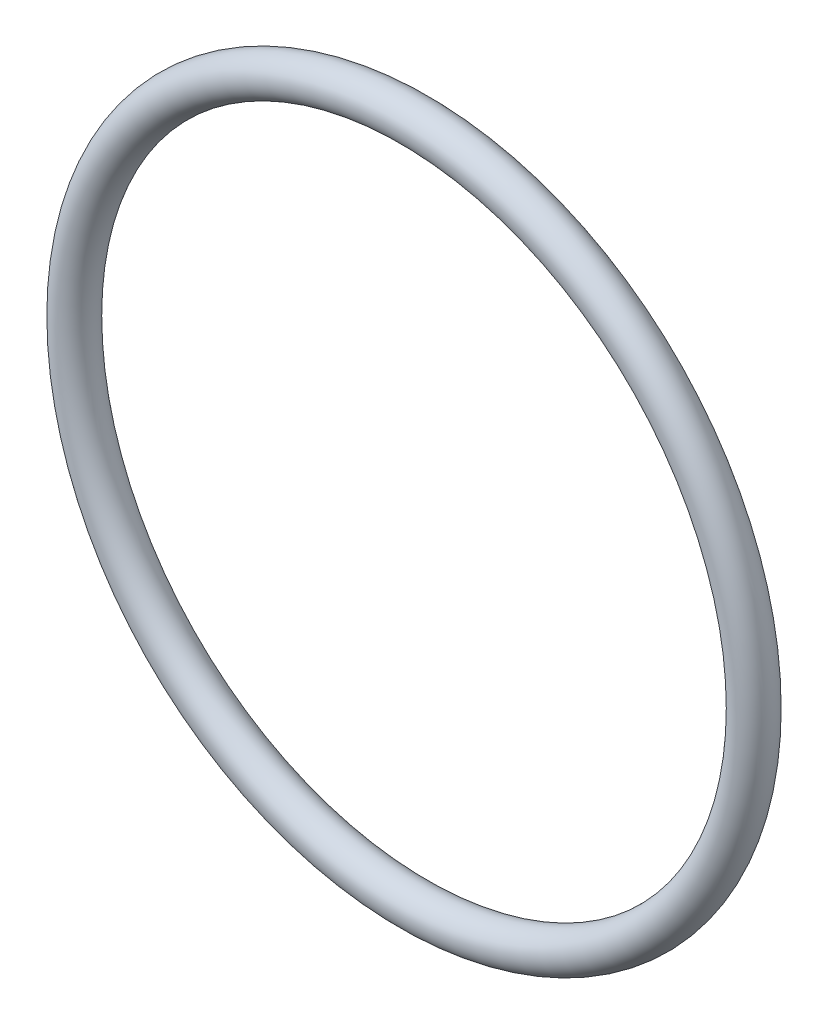
ISO-10303-21;
HEADER;
FILE_DESCRIPTION(('STEP AP214'),'2;1');
FILE_NAME('part.step','',(''),(''),'','','');
FILE_SCHEMA(('AUTOMOTIVE_DESIGN { 1 0 10303 214 1 1 1 1 }'));
ENDSEC;
DATA;
#1=APPLICATION_CONTEXT('core data for automotive mechanical design processes');
#2=APPLICATION_PROTOCOL_DEFINITION('international standard','automotive_design',2000,#1);
#3=PRODUCT_CONTEXT('',#1,'mechanical');
#4=PRODUCT('Part','Part','',(#3));
#5=PRODUCT_RELATED_PRODUCT_CATEGORY('part','',(#4));
#6=PRODUCT_DEFINITION_FORMATION('','',#4);
#7=PRODUCT_DEFINITION_CONTEXT('part definition',#1,'design');
#8=PRODUCT_DEFINITION('design','',#6,#7);
#9=PRODUCT_DEFINITION_SHAPE('','',#8);
#10=(LENGTH_UNIT() NAMED_UNIT(*) SI_UNIT(.MILLI.,.METRE.));
#11=(NAMED_UNIT(*) PLANE_ANGLE_UNIT() SI_UNIT($,.RADIAN.));
#12=(NAMED_UNIT(*) SI_UNIT($,.STERADIAN.) SOLID_ANGLE_UNIT());
#13=UNCERTAINTY_MEASURE_WITH_UNIT(LENGTH_MEASURE(1.E-05),#10,'distance_accuracy_value','');
#14=(GEOMETRIC_REPRESENTATION_CONTEXT(3) GLOBAL_UNCERTAINTY_ASSIGNED_CONTEXT((#13)) GLOBAL_UNIT_ASSIGNED_CONTEXT((#10,
#11,#12)) REPRESENTATION_CONTEXT('',''));
#15=CARTESIAN_POINT('',(0.,0.,0.));
#16=DIRECTION('',(0.,0.,1.));
#17=DIRECTION('',(1.,0.,0.));
#18=AXIS2_PLACEMENT_3D('',#15,#16,#17);
#19=CARTESIAN_POINT('',(-17.5,0.,0.));
#20=DIRECTION('',(0.,0.,-1.));
#21=DIRECTION('',(-1.,0.,0.));
#22=AXIS2_PLACEMENT_3D('',#19,#20,#21);
#23=TOROIDAL_SURFACE('',#22,17.5,1.);
#24=CARTESIAN_POINT('',(-36.,0.,0.));
#25=VERTEX_POINT('',#24);
#26=VERTEX_LOOP('',#25);
#27=FACE_BOUND('',#26,.T.);
#28=ADVANCED_FACE('F32',(#27),#23,.T.);
#29=CLOSED_SHELL('',(#28));
#30=MANIFOLD_SOLID_BREP('B2',#29);
#31=ADVANCED_BREP_SHAPE_REPRESENTATION('',(#18,#30),#14);
#32=SHAPE_DEFINITION_REPRESENTATION(#9,#31);
ENDSEC;
END-ISO-10303-21;
